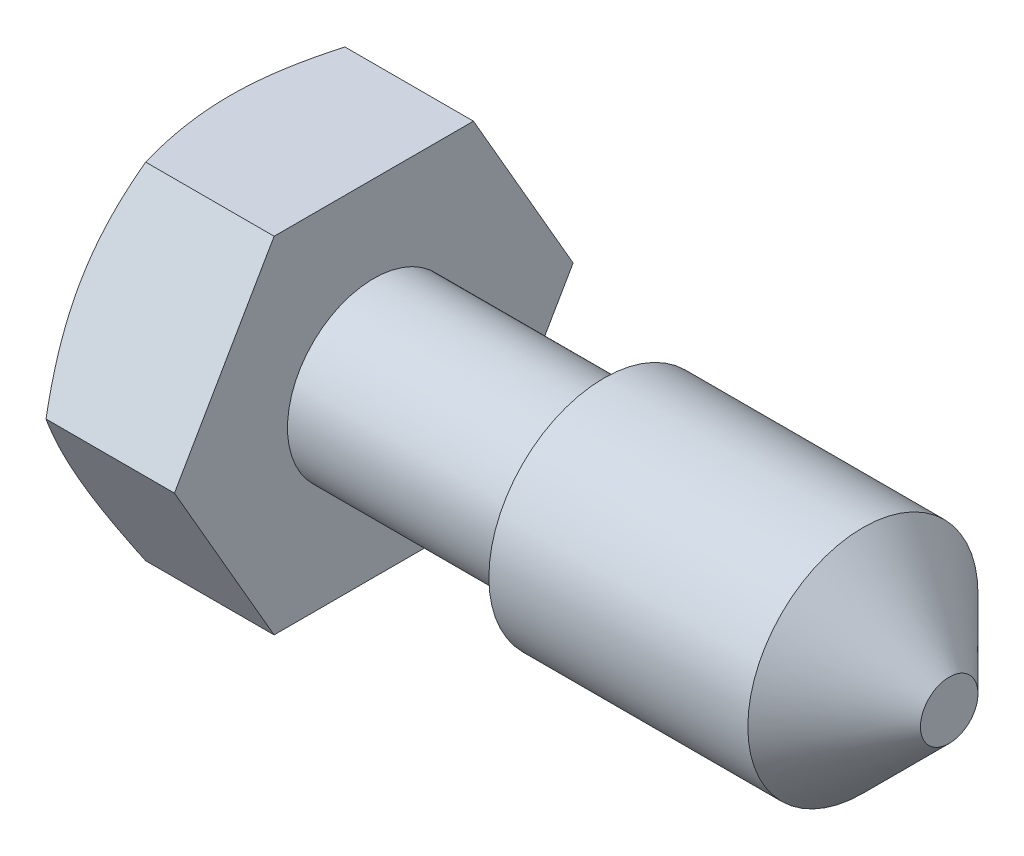
ISO-10303-21;
HEADER;
FILE_DESCRIPTION(('STEP AP214'),'2;1');
FILE_NAME('part.step','',(''),(''),'','','');
FILE_SCHEMA(('AUTOMOTIVE_DESIGN { 1 0 10303 214 1 1 1 1 }'));
ENDSEC;
DATA;
#1=APPLICATION_CONTEXT('core data for automotive mechanical design processes');
#2=APPLICATION_PROTOCOL_DEFINITION('international standard','automotive_design',2000,#1);
#3=PRODUCT_CONTEXT('',#1,'mechanical');
#4=PRODUCT('Part','Part','',(#3));
#5=PRODUCT_RELATED_PRODUCT_CATEGORY('part','',(#4));
#6=PRODUCT_DEFINITION_FORMATION('','',#4);
#7=PRODUCT_DEFINITION_CONTEXT('part definition',#1,'design');
#8=PRODUCT_DEFINITION('design','',#6,#7);
#9=PRODUCT_DEFINITION_SHAPE('','',#8);
#10=(LENGTH_UNIT() NAMED_UNIT(*) SI_UNIT(.MILLI.,.METRE.));
#11=(NAMED_UNIT(*) PLANE_ANGLE_UNIT() SI_UNIT($,.RADIAN.));
#12=(NAMED_UNIT(*) SI_UNIT($,.STERADIAN.) SOLID_ANGLE_UNIT());
#13=UNCERTAINTY_MEASURE_WITH_UNIT(LENGTH_MEASURE(1.E-05),#10,'distance_accuracy_value','');
#14=(GEOMETRIC_REPRESENTATION_CONTEXT(3) GLOBAL_UNCERTAINTY_ASSIGNED_CONTEXT((#13)) GLOBAL_UNIT_ASSIGNED_CONTEXT((#10,
#11,#12)) REPRESENTATION_CONTEXT('',''));
#15=CARTESIAN_POINT('',(0.,0.,0.));
#16=DIRECTION('',(0.,0.,1.));
#17=DIRECTION('',(1.,0.,0.));
#18=AXIS2_PLACEMENT_3D('',#15,#16,#17);
#19=CARTESIAN_POINT('',(-3.6999540897682,10.7708461331692,-12.5040193377703));
#20=DIRECTION('',(0.,-1.,0.));
#21=DIRECTION('',(0.,0.,-1.));
#22=AXIS2_PLACEMENT_3D('',#19,#20,#21);
#23=PLANE('',#22);
#24=CARTESIAN_POINT('',(-7.79862520358654,10.7708461331692,-24.2785079720801));
#25=CARTESIAN_POINT('',(-7.92616860120049,10.7708461331692,-24.0160290351992));
#26=CARTESIAN_POINT('',(-8.05308288373378,10.7708461331692,-23.7532445436197));
#27=CARTESIAN_POINT('',(-8.30551089529924,10.7708461331692,-23.2270007093558));
#28=CARTESIAN_POINT('',(-8.43102461052053,10.7708461331692,-22.9635413600481));
#29=CARTESIAN_POINT('',(-8.80528392837625,10.7708461331692,-22.1719864756887));
#30=CARTESIAN_POINT('',(-9.05171053885915,10.7708461331692,-21.6427903793231));
#31=CARTESIAN_POINT('',(-9.53821325997345,10.7708461331692,-20.578052072102));
#32=CARTESIAN_POINT('',(-9.77824830686955,10.7708461331692,-20.0424910537786));
#33=CARTESIAN_POINT('',(-10.2486199906724,10.7708461331692,-18.9671413773528));
#34=CARTESIAN_POINT('',(-10.4789570800287,10.7708461331692,-18.4273529178745));
#35=CARTESIAN_POINT('',(-10.9346553259399,10.7708461331692,-17.3250649512966));
#36=CARTESIAN_POINT('',(-11.1596118049447,10.7708461331692,-16.7623972797285));
#37=CARTESIAN_POINT('',(-11.5927233994467,10.7708461331692,-15.6305099649649));
#38=CARTESIAN_POINT('',(-11.8008766430938,10.7708461331692,-15.0612895998593));
#39=CARTESIAN_POINT('',(-12.1949830715048,10.7708461331692,-13.916444639012));
#40=CARTESIAN_POINT('',(-12.3809803659526,10.7708461331692,-13.3408353493094));
#41=CARTESIAN_POINT('',(-12.7248795649057,10.7708461331692,-12.1813070209649));
#42=CARTESIAN_POINT('',(-12.8827902173579,10.7708461331692,-11.5973906310871));
#43=CARTESIAN_POINT('',(-13.0925010571857,10.7708461331692,-10.7167559431438));
#44=CARTESIAN_POINT('',(-13.1577385617961,10.7708461331692,-10.4232187672798));
#45=CARTESIAN_POINT('',(-13.2783880358251,10.7708461331692,-9.83412159382931));
#46=CARTESIAN_POINT('',(-13.3338002026922,10.7708461331692,-9.53856163701627));
#47=CARTESIAN_POINT('',(-13.4338264849745,10.7708461331692,-8.94561692193409));
#48=CARTESIAN_POINT('',(-13.4784408143115,10.7708461331692,-8.64823219993605));
#49=CARTESIAN_POINT('',(-13.5559852282152,10.7708461331692,-8.05194449500687));
#50=CARTESIAN_POINT('',(-13.5889157735745,10.7708461331692,-7.75304157242322));
#51=CARTESIAN_POINT('',(-13.6420200808553,10.7708461331692,-7.15808075291311));
#52=CARTESIAN_POINT('',(-13.6623567364114,10.7708461331692,-6.86203748531017));
#53=CARTESIAN_POINT('',(-13.6904876308972,10.7708461331692,-6.26935655333435));
#54=CARTESIAN_POINT('',(-13.6982820808168,10.7708461331692,-5.97271889904453));
#55=CARTESIAN_POINT('',(-13.7011427479652,10.7708461331692,-5.37937709768416));
#56=CARTESIAN_POINT('',(-13.6962088447653,10.7708461331692,-5.08267295001105));
#57=CARTESIAN_POINT('',(-13.6737343471042,10.7708461331692,-4.48973920479841));
#58=CARTESIAN_POINT('',(-13.656193152374,10.7708461331692,-4.19350963052777));
#59=CARTESIAN_POINT('',(-13.599495740519,10.7708461331692,-3.48450716239107));
#60=CARTESIAN_POINT('',(-13.5545207782692,10.7708461331692,-3.07218950972229));
#61=CARTESIAN_POINT('',(-13.4425777383644,10.7708461331692,-2.25057202366847));
#62=CARTESIAN_POINT('',(-13.3756067575884,10.7708461331692,-1.84127259593549));
#63=CARTESIAN_POINT('',(-13.1452476149779,10.7708461331692,-0.618404788492472));
#64=CARTESIAN_POINT('',(-12.9524525416108,10.7708461331692,0.189699669272059));
#65=CARTESIAN_POINT('',(-12.6175172191385,10.7708461331692,1.39842321332606));
#66=CARTESIAN_POINT('',(-12.4966275966155,10.7708461331692,1.8052913367039));
#67=CARTESIAN_POINT('',(-12.2421492722448,10.7708461331692,2.61507574427068));
#68=CARTESIAN_POINT('',(-12.1085604780517,10.7708461331692,3.01799199969903));
#69=CARTESIAN_POINT('',(-11.8308395372812,10.7708461331692,3.82000047140178));
#70=CARTESIAN_POINT('',(-11.6867106742926,10.7708461331692,4.21909383518556));
#71=CARTESIAN_POINT('',(-11.3896200984054,10.7708461331692,5.01396036559093));
#72=CARTESIAN_POINT('',(-11.2366585514058,10.7708461331692,5.40973359441283));
#73=CARTESIAN_POINT('',(-10.830472163266,10.7708461331692,6.43218761258803));
#74=CARTESIAN_POINT('',(-10.5715826826644,10.7708461331692,7.05661533493362));
#75=CARTESIAN_POINT('',(-10.0396572120568,10.7708461331692,8.29943687712516));
#76=CARTESIAN_POINT('',(-9.76661993123361,10.7708461331692,8.91783014026071));
#77=CARTESIAN_POINT('',(-9.20959061586262,10.7708461331692,10.1498876568979));
#78=CARTESIAN_POINT('',(-8.92559507910244,10.7708461331692,10.7635503220704));
#79=CARTESIAN_POINT('',(-8.34914364870746,10.7708461331692,11.9868520584745));
#80=CARTESIAN_POINT('',(-8.05668803421583,10.7708461331692,12.5964912616482));
#81=CARTESIAN_POINT('',(-7.46466110760158,10.7708461331692,13.8133640821045));
#82=CARTESIAN_POINT('',(-7.16508032250713,10.7708461331692,14.4205930815326));
#83=CARTESIAN_POINT('',(-6.5605343922391,10.7708461331692,15.6323656508118));
#84=CARTESIAN_POINT('',(-6.25556921098749,10.7708461331692,16.236909202635));
#85=CARTESIAN_POINT('',(-5.6413271392423,10.7708461331692,17.4436604798141));
#86=CARTESIAN_POINT('',(-5.33205104553331,10.7708461331692,18.0458686111991));
#87=CARTESIAN_POINT('',(-4.70990984010232,10.7708461331692,19.2484240893817));
#88=CARTESIAN_POINT('',(-4.39704473803169,10.7708461331692,19.8487714411776));
#89=CARTESIAN_POINT('',(-3.51592364439311,10.7708461331692,21.5293742702445));
#90=CARTESIAN_POINT('',(-2.94433045497042,10.7708461331692,22.6078798293189));
#91=CARTESIAN_POINT('',(-1.79408206881537,10.7708461331692,24.7611810896639));
#92=CARTESIAN_POINT('',(-1.21542650977689,10.7708461331692,25.8359765969462));
#93=CARTESIAN_POINT('',(-0.0545642757393282,10.7708461331692,27.9794465906795));
#94=CARTESIAN_POINT('',(0.527626378966382,10.7708461331692,29.0481297590757));
#95=CARTESIAN_POINT('',(1.40394618170066,10.7708461331692,30.6494446427062));
#96=CARTESIAN_POINT('',(1.69654838523079,10.7708461331692,31.1829131217748));
#97=CARTESIAN_POINT('',(2.28265973081763,10.7708461331692,32.2493507606034));
#98=CARTESIAN_POINT('',(2.57616887168669,10.7708461331692,32.7823199210161));
#99=CARTESIAN_POINT('',(2.87007644480844,10.7708461331692,33.3150693311648));
#100=B_SPLINE_CURVE_WITH_KNOTS('',3,(#24,#25,#26,#27,#28,#29,#30,#31,#32,#33,#34,#35,#36,#37,
#38,#39,#40,#41,#42,#43,#44,#45,#46,#47,#48,#49,#50,#51,#52,#53,#54,#55,#56,#57,#58,#59,#60,#61,
#62,#63,#64,#65,#66,#67,#68,#69,#70,#71,#72,#73,#74,#75,#76,#77,#78,#79,#80,#81,#82,#83,#84,#85,
#86,#87,#88,#89,#90,#91,#92,#93,#94,#95,#96,#97,#98,#99),.UNSPECIFIED.,.F.,.F.,(4,2,2,2,2,2,2,2,
2,2,2,2,2,2,2,2,2,2,2,2,2,2,2,2,2,2,2,2,2,2,2,2,2,2,2,2,2,4),(0.,0.875476937735774,
1.75096250086668,3.50218815524043,5.26278972808009,7.02330907040262,8.84101582430342,
10.6589247888162,12.4731517962467,14.286812745989,15.1887724983129,16.0907141229465,
16.9926378772739,17.894526056997,18.7844909581056,19.6744408877206,20.5643992375781,
21.4543999637003,22.6979894897215,23.9417432155749,26.4305504632448,27.7037852974542,
28.9770293910429,30.2498785019908,31.5227037135423,33.5503569192111,35.5781954508164,
37.6066875279943,39.6351127505492,41.6664049116571,43.6977106885628,45.7286458713806,
47.7595755939941,51.4213702656134,55.0833535869815,58.7342681825016,60.559600938406,
62.3849313049939),.UNSPECIFIED.);
#101=CARTESIAN_POINT('',(-12.6281573200437,10.7708461331692,1.35238712278069));
#102=VERTEX_POINT('',#101);
#103=CARTESIAN_POINT('',(-13.6999540897682,10.7708461331692,-5.57581610749481));
#104=VERTEX_POINT('',#103);
#105=EDGE_CURVE('E33',#102,#104,#100,.F.);
#106=ORIENTED_EDGE('',*,*,#105,.F.);
#107=DIRECTION('',(-1.,0.,0.));
#108=VECTOR('',#107,1.);
#109=CARTESIAN_POINT('',(-3.6999540897682,10.7708461331692,1.35238712278069));
#110=LINE('',#109,#108);
#111=CARTESIAN_POINT('',(-3.6999540897682,10.7708461331692,1.35238712278069));
#112=VERTEX_POINT('',#111);
#113=EDGE_CURVE('E127',#112,#102,#110,.T.);
#114=ORIENTED_EDGE('',*,*,#113,.F.);
#115=DIRECTION('',(0.,0.,1.));
#116=VECTOR('',#115,1.);
#117=CARTESIAN_POINT('',(-3.6999540897682,10.7708461331692,-12.5040193377703));
#118=LINE('',#117,#116);
#119=CARTESIAN_POINT('',(-3.6999540897682,10.7708461331692,-12.5040193377703));
#120=VERTEX_POINT('',#119);
#121=EDGE_CURVE('E262',#120,#112,#118,.T.);
#122=ORIENTED_EDGE('',*,*,#121,.F.);
#123=DIRECTION('',(-1.,0.,0.));
#124=VECTOR('',#123,1.);
#125=CARTESIAN_POINT('',(-3.6999540897682,10.7708461331692,-12.5040193377703));
#126=LINE('',#125,#124);
#127=CARTESIAN_POINT('',(-12.6281573200437,10.7708461331692,-12.5040193377703));
#128=VERTEX_POINT('',#127);
#129=EDGE_CURVE('E116',#120,#128,#126,.T.);
#130=ORIENTED_EDGE('',*,*,#129,.T.);
#131=EDGE_CURVE('E109',#104,#128,#100,.F.);
#132=ORIENTED_EDGE('',*,*,#131,.F.);
#133=EDGE_LOOP('',(#106,#114,#122,#130,#132));
#134=FACE_BOUND('',#133,.T.);
#135=ADVANCED_FACE('F16',(#134),#23,.F.);
#136=CARTESIAN_POINT('',(-3.6999540897682,10.7708461331692,1.35238712278069));
#137=DIRECTION('',(0.,-0.5,-0.866025403784438));
#138=DIRECTION('',(0.,0.866025403784439,-0.5));
#139=AXIS2_PLACEMENT_3D('',#136,#137,#138);
#140=PLANE('',#139);
#141=CARTESIAN_POINT('',(-12.6280906525437,-1.22935386683076,8.28070582311004));
#142=CARTESIAN_POINT('',(-12.7160044575824,-0.965568071588494,8.12840902321852));
#143=CARTESIAN_POINT('',(-12.7999280922115,-0.700798747448957,7.9755443826534));
#144=CARTESIAN_POINT('',(-12.9586878708954,-0.169136850301095,7.66858924321722));
#145=CARTESIAN_POINT('',(-13.0335210260946,0.0977563904623134,7.51449835881757));
#146=CARTESIAN_POINT('',(-13.2429365499141,0.902736539148251,7.04974285328144));
#147=CARTESIAN_POINT('',(-13.3620508530454,1.44400120699434,6.73724355159767));
#148=CARTESIAN_POINT('',(-13.5017230287651,2.25397896232424,6.26960267652034));
#149=CARTESIAN_POINT('',(-13.5415102927278,2.52027223365061,6.11585818463667));
#150=CARTESIAN_POINT('',(-13.6082307205511,3.05409173186608,5.8076573536433));
#151=CARTESIAN_POINT('',(-13.6351636370004,3.32161798238662,5.65320100088998));
#152=CARTESIAN_POINT('',(-13.6754854978513,3.85711649949459,5.34403078788705));
#153=CARTESIAN_POINT('',(-13.6888905368859,4.12508785523796,5.1893174535135));
#154=CARTESIAN_POINT('',(-13.701870996011,4.66127886544327,4.8797474294344));
#155=CARTESIAN_POINT('',(-13.7014468434055,4.92949851197727,4.72489074430605));
#156=CARTESIAN_POINT('',(-13.6877340704254,5.43093551195334,4.43538595738823));
#157=CARTESIAN_POINT('',(-13.6761181071897,5.66418862634699,4.30071720900374));
#158=CARTESIAN_POINT('',(-13.6426460808958,6.1301583749,4.03168944924244));
#159=CARTESIAN_POINT('',(-13.620789293502,6.36287496994101,3.89733046045062));
#160=CARTESIAN_POINT('',(-13.5672166732253,6.82764520921218,3.62899523769608));
#161=CARTESIAN_POINT('',(-13.5354926972753,7.05969814553124,3.49501941244603));
#162=CARTESIAN_POINT('',(-13.4627423140978,7.52271610047422,3.22769587152007));
#163=CARTESIAN_POINT('',(-13.421715274585,7.75368104406278,3.09434819916585));
#164=CARTESIAN_POINT('',(-13.2836424364864,8.45478809193291,2.68956385634729));
#165=CARTESIAN_POINT('',(-13.1728292014289,8.92289987944777,2.41929938981474));
#166=CARTESIAN_POINT('',(-12.9213283228303,9.85214324076066,1.88280048501807));
#167=CARTESIAN_POINT('',(-12.7806997471088,10.3132867124614,1.61655917749661));
#168=CARTESIAN_POINT('',(-12.6280906525437,10.7710461331692,1.35227165272685));
#169=B_SPLINE_CURVE_WITH_KNOTS('',3,(#141,#142,#143,#144,#145,#146,#147,#148,#149,#150,#151,
#152,#153,#154,#155,#156,#157,#158,#159,#160,#161,#162,#163,#164,#165,#166,#167,#168),
.UNSPECIFIED.,.F.,.F.,(4,2,2,2,2,2,2,2,2,2,2,2,2,4),(0.,0.951004872251243,1.90232158356437,
3.80900466161368,4.73894551413569,5.66890426477608,6.59775529889864,7.52657763276929,
8.33514643820577,9.14377244252748,9.95306755799764,10.7624176939264,12.4167102786892,
14.0677556316691),.UNSPECIFIED.);
#170=CARTESIAN_POINT('',(-12.6281573200437,-1.22915386683076,8.2805903530562));
#171=VERTEX_POINT('',#170);
#172=CARTESIAN_POINT('',(-13.6999540897682,4.77084613316925,4.81648873791846));
#173=VERTEX_POINT('',#172);
#174=EDGE_CURVE('E39',#171,#173,#169,.T.);
#175=ORIENTED_EDGE('',*,*,#174,.F.);
#176=DIRECTION('',(-1.,0.,0.));
#177=VECTOR('',#176,1.);
#178=CARTESIAN_POINT('',(-3.6999540897682,-1.22915386683076,8.2805903530562));
#179=LINE('',#178,#177);
#180=CARTESIAN_POINT('',(-3.6999540897682,-1.22915386683076,8.2805903530562));
#181=VERTEX_POINT('',#180);
#182=EDGE_CURVE('E130',#181,#171,#179,.T.);
#183=ORIENTED_EDGE('',*,*,#182,.F.);
#184=DIRECTION('',(0.,-0.866025403784438,0.5));
#185=VECTOR('',#184,1.);
#186=CARTESIAN_POINT('',(-3.6999540897682,10.7708461331692,1.35238712278069));
#187=LINE('',#186,#185);
#188=EDGE_CURVE('E261',#112,#181,#187,.T.);
#189=ORIENTED_EDGE('',*,*,#188,.F.);
#190=ORIENTED_EDGE('',*,*,#113,.T.);
#191=EDGE_CURVE('E176',#173,#102,#169,.T.);
#192=ORIENTED_EDGE('',*,*,#191,.F.);
#193=EDGE_LOOP('',(#175,#183,#189,#190,#192));
#194=FACE_BOUND('',#193,.T.);
#195=ADVANCED_FACE('F248',(#194),#140,.F.);
#196=CARTESIAN_POINT('',(-3.6999540897682,-1.22915386683076,8.2805903530562));
#197=DIRECTION('',(0.,0.5,-0.866025403784439));
#198=DIRECTION('',(0.,0.866025403784439,0.5));
#199=AXIS2_PLACEMENT_3D('',#196,#197,#198);
#200=PLANE('',#199);
#201=CARTESIAN_POINT('',(-12.6280906525437,-13.2293538668308,1.35227165272686));
#202=CARTESIAN_POINT('',(-12.7160044575823,-12.9655680715885,1.50456845261838));
#203=CARTESIAN_POINT('',(-12.7999280922115,-12.700798747449,1.6574330931835));
#204=CARTESIAN_POINT('',(-12.9586878708954,-12.1691368503011,1.96438823261968));
#205=CARTESIAN_POINT('',(-13.0335210260946,-11.9022436095377,2.11847911701933));
#206=CARTESIAN_POINT('',(-13.2429365499141,-11.0972634608517,2.58323462255546));
#207=CARTESIAN_POINT('',(-13.3620508530454,-10.5559987930057,2.89573392423923));
#208=CARTESIAN_POINT('',(-13.5017230287651,-9.74602103767576,3.36337479931655));
#209=CARTESIAN_POINT('',(-13.5415102927278,-9.47972776634938,3.51711929120022));
#210=CARTESIAN_POINT('',(-13.6082307205511,-8.94590826813392,3.82532012219359));
#211=CARTESIAN_POINT('',(-13.6351636370004,-8.67838201761338,3.97977647494692));
#212=CARTESIAN_POINT('',(-13.6754854978513,-8.14288350050541,4.28894668794985));
#213=CARTESIAN_POINT('',(-13.6888905368859,-7.87491214476203,4.4436600223234));
#214=CARTESIAN_POINT('',(-13.701870996011,-7.33872113455672,4.75323004640249));
#215=CARTESIAN_POINT('',(-13.7014468434055,-7.07050148802272,4.90808673153084));
#216=CARTESIAN_POINT('',(-13.6877340704254,-6.56906448804666,5.19759151844866));
#217=CARTESIAN_POINT('',(-13.6761181071897,-6.335811373653,5.33226026683316));
#218=CARTESIAN_POINT('',(-13.6426460808958,-5.86984162509999,5.60128802659446));
#219=CARTESIAN_POINT('',(-13.620789293502,-5.63712503005899,5.73564701538628));
#220=CARTESIAN_POINT('',(-13.5672166732253,-5.17235479078781,6.00398223814081));
#221=CARTESIAN_POINT('',(-13.5354926972753,-4.94030185446875,6.13795806339087));
#222=CARTESIAN_POINT('',(-13.4627423140978,-4.47728389952578,6.40528160431682));
#223=CARTESIAN_POINT('',(-13.421715274585,-4.24631895593722,6.53862927667105));
#224=CARTESIAN_POINT('',(-13.2836424364864,-3.54521190806709,6.94341361948961));
#225=CARTESIAN_POINT('',(-13.1728292014289,-3.07710012055223,7.21367808602215));
#226=CARTESIAN_POINT('',(-12.9213283228303,-2.14785675923933,7.75017699081882));
#227=CARTESIAN_POINT('',(-12.7806997471088,-1.6867132875386,8.01641829834028));
#228=CARTESIAN_POINT('',(-12.6280906525437,-1.22895386683075,8.28070582311004));
#229=B_SPLINE_CURVE_WITH_KNOTS('',3,(#201,#202,#203,#204,#205,#206,#207,#208,#209,#210,#211,
#212,#213,#214,#215,#216,#217,#218,#219,#220,#221,#222,#223,#224,#225,#226,#227,#228),
.UNSPECIFIED.,.F.,.F.,(4,2,2,2,2,2,2,2,2,2,2,2,2,4),(0.,0.951004872251244,1.90232158356437,
3.80900466161368,4.73894551413569,5.66890426477608,6.59775529889864,7.52657763276929,
8.33514643820578,9.14377244252748,9.95306755799765,10.7624176939264,12.4167102786892,
14.0677556316691),.UNSPECIFIED.);
#230=CARTESIAN_POINT('',(-12.6281573200437,-13.2291538668308,1.3523871227807));
#231=VERTEX_POINT('',#230);
#232=CARTESIAN_POINT('',(-13.6999540897682,-7.22915386683076,4.81648873791846));
#233=VERTEX_POINT('',#232);
#234=EDGE_CURVE('E161',#231,#233,#229,.T.);
#235=ORIENTED_EDGE('',*,*,#234,.F.);
#236=DIRECTION('',(-1.,0.,0.));
#237=VECTOR('',#236,1.);
#238=CARTESIAN_POINT('',(-3.6999540897682,-13.2291538668308,1.3523871227807));
#239=LINE('',#238,#237);
#240=CARTESIAN_POINT('',(-3.6999540897682,-13.2291538668308,1.3523871227807));
#241=VERTEX_POINT('',#240);
#242=EDGE_CURVE('E119',#241,#231,#239,.T.);
#243=ORIENTED_EDGE('',*,*,#242,.F.);
#244=DIRECTION('',(0.,-0.866025403784439,-0.5));
#245=VECTOR('',#244,1.);
#246=CARTESIAN_POINT('',(-3.6999540897682,-1.22915386683076,8.2805903530562));
#247=LINE('',#246,#245);
#248=EDGE_CURVE('E263',#181,#241,#247,.T.);
#249=ORIENTED_EDGE('',*,*,#248,.F.);
#250=ORIENTED_EDGE('',*,*,#182,.T.);
#251=EDGE_CURVE('E151',#233,#171,#229,.T.);
#252=ORIENTED_EDGE('',*,*,#251,.F.);
#253=EDGE_LOOP('',(#235,#243,#249,#250,#252));
#254=FACE_BOUND('',#253,.T.);
#255=ADVANCED_FACE('F157',(#254),#200,.F.);
#256=CARTESIAN_POINT('',(-3.6999540897682,-13.2291538668308,1.3523871227807));
#257=DIRECTION('',(0.,1.,0.));
#258=DIRECTION('',(0.,0.,1.));
#259=AXIS2_PLACEMENT_3D('',#256,#257,#258);
#260=PLANE('',#259);
#261=CARTESIAN_POINT('',(-7.79862520358655,-13.2291538668308,-24.2785079720801));
#262=CARTESIAN_POINT('',(-7.92616860120049,-13.2291538668308,-24.0160290351992));
#263=CARTESIAN_POINT('',(-8.05308288373378,-13.2291538668308,-23.7532445436197));
#264=CARTESIAN_POINT('',(-8.30551089529925,-13.2291538668308,-23.2270007093558));
#265=CARTESIAN_POINT('',(-8.43102461052054,-13.2291538668308,-22.963541360048));
#266=CARTESIAN_POINT('',(-8.80528392837626,-13.2291538668308,-22.1719864756887));
#267=CARTESIAN_POINT('',(-9.05171053885916,-13.2291538668308,-21.6427903793231));
#268=CARTESIAN_POINT('',(-9.53821325997346,-13.2291538668308,-20.578052072102));
#269=CARTESIAN_POINT('',(-9.77824830686955,-13.2291538668308,-20.0424910537786));
#270=CARTESIAN_POINT('',(-10.2486199906724,-13.2291538668308,-18.9671413773528));
#271=CARTESIAN_POINT('',(-10.4789570800287,-13.2291538668308,-18.4273529178745));
#272=CARTESIAN_POINT('',(-10.9346553259399,-13.2291538668308,-17.3250649512966));
#273=CARTESIAN_POINT('',(-11.1596118049448,-13.2291538668308,-16.7623972797285));
#274=CARTESIAN_POINT('',(-11.5927233994467,-13.2291538668308,-15.6305099649649));
#275=CARTESIAN_POINT('',(-11.8008766430938,-13.2291538668308,-15.0612895998593));
#276=CARTESIAN_POINT('',(-12.1949830715048,-13.2291538668308,-13.916444639012));
#277=CARTESIAN_POINT('',(-12.3809803659526,-13.2291538668308,-13.3408353493094));
#278=CARTESIAN_POINT('',(-12.7248795649057,-13.2291538668308,-12.1813070209649));
#279=CARTESIAN_POINT('',(-12.8827902173579,-13.2291538668308,-11.597390631087));
#280=CARTESIAN_POINT('',(-13.0925010571857,-13.2291538668308,-10.7167559431438));
#281=CARTESIAN_POINT('',(-13.1577385617961,-13.2291538668308,-10.4232187672798));
#282=CARTESIAN_POINT('',(-13.2783880358251,-13.2291538668308,-9.8341215938293));
#283=CARTESIAN_POINT('',(-13.3338002026922,-13.2291538668308,-9.53856163701627));
#284=CARTESIAN_POINT('',(-13.4338264849745,-13.2291538668308,-8.94561692193409));
#285=CARTESIAN_POINT('',(-13.4784408143115,-13.2291538668308,-8.64823219993604));
#286=CARTESIAN_POINT('',(-13.5559852282152,-13.2291538668308,-8.05194449500687));
#287=CARTESIAN_POINT('',(-13.5889157735745,-13.2291538668308,-7.75304157242321));
#288=CARTESIAN_POINT('',(-13.6420200808553,-13.2291538668308,-7.15808075291311));
#289=CARTESIAN_POINT('',(-13.6623567364114,-13.2291538668308,-6.86203748531017));
#290=CARTESIAN_POINT('',(-13.6904876308972,-13.2291538668308,-6.26935655333435));
#291=CARTESIAN_POINT('',(-13.6982820808168,-13.2291538668308,-5.97271889904453));
#292=CARTESIAN_POINT('',(-13.7011427479652,-13.2291538668308,-5.37937709768416));
#293=CARTESIAN_POINT('',(-13.6962088447653,-13.2291538668308,-5.08267295001105));
#294=CARTESIAN_POINT('',(-13.6737343471043,-13.2291538668308,-4.48973920479841));
#295=CARTESIAN_POINT('',(-13.656193152374,-13.2291538668308,-4.19350963052777));
#296=CARTESIAN_POINT('',(-13.599495740519,-13.2291538668308,-3.48450716239107));
#297=CARTESIAN_POINT('',(-13.5545207782692,-13.2291538668308,-3.07218950972229));
#298=CARTESIAN_POINT('',(-13.4425777383644,-13.2291538668308,-2.25057202366846));
#299=CARTESIAN_POINT('',(-13.3756067575884,-13.2291538668308,-1.84127259593548));
#300=CARTESIAN_POINT('',(-13.1452476149779,-13.2291538668308,-0.618404788492465));
#301=CARTESIAN_POINT('',(-12.9524525416108,-13.2291538668308,0.189699669272065));
#302=CARTESIAN_POINT('',(-12.6175172191385,-13.2291538668308,1.39842321332606));
#303=CARTESIAN_POINT('',(-12.4966275966155,-13.2291538668308,1.80529133670391));
#304=CARTESIAN_POINT('',(-12.2421492722448,-13.2291538668308,2.61507574427068));
#305=CARTESIAN_POINT('',(-12.1085604780517,-13.2291538668308,3.01799199969904));
#306=CARTESIAN_POINT('',(-11.8308395372812,-13.2291538668308,3.82000047140179));
#307=CARTESIAN_POINT('',(-11.6867106742926,-13.2291538668308,4.21909383518557));
#308=CARTESIAN_POINT('',(-11.3896200984054,-13.2291538668308,5.01396036559094));
#309=CARTESIAN_POINT('',(-11.2366585514058,-13.2291538668308,5.40973359441284));
#310=CARTESIAN_POINT('',(-10.830472163266,-13.2291538668308,6.43218761258803));
#311=CARTESIAN_POINT('',(-10.5715826826644,-13.2291538668308,7.05661533493363));
#312=CARTESIAN_POINT('',(-10.0396572120568,-13.2291538668308,8.29943687712516));
#313=CARTESIAN_POINT('',(-9.76661993123361,-13.2291538668308,8.91783014026072));
#314=CARTESIAN_POINT('',(-9.20959061586262,-13.2291538668308,10.1498876568979));
#315=CARTESIAN_POINT('',(-8.92559507910244,-13.2291538668308,10.7635503220704));
#316=CARTESIAN_POINT('',(-8.34914364870746,-13.2291538668308,11.9868520584745));
#317=CARTESIAN_POINT('',(-8.05668803421583,-13.2291538668308,12.5964912616482));
#318=CARTESIAN_POINT('',(-7.46466110760158,-13.2291538668308,13.8133640821045));
#319=CARTESIAN_POINT('',(-7.16508032250713,-13.2291538668308,14.4205930815326));
#320=CARTESIAN_POINT('',(-6.5605343922391,-13.2291538668308,15.6323656508118));
#321=CARTESIAN_POINT('',(-6.25556921098749,-13.2291538668308,16.236909202635));
#322=CARTESIAN_POINT('',(-5.6413271392423,-13.2291538668308,17.4436604798141));
#323=CARTESIAN_POINT('',(-5.33205104553331,-13.2291538668308,18.0458686111991));
#324=CARTESIAN_POINT('',(-4.70990984010232,-13.2291538668308,19.2484240893817));
#325=CARTESIAN_POINT('',(-4.39704473803169,-13.2291538668308,19.8487714411776));
#326=CARTESIAN_POINT('',(-3.51592364439311,-13.2291538668308,21.5293742702445));
#327=CARTESIAN_POINT('',(-2.94433045497042,-13.2291538668308,22.6078798293189));
#328=CARTESIAN_POINT('',(-1.79408206881538,-13.2291538668308,24.7611810896639));
#329=CARTESIAN_POINT('',(-1.2154265097769,-13.2291538668308,25.8359765969462));
#330=CARTESIAN_POINT('',(-0.0545642757393337,-13.2291538668308,27.9794465906795));
#331=CARTESIAN_POINT('',(0.527626378966382,-13.2291538668308,29.0481297590757));
#332=CARTESIAN_POINT('',(1.40394618170066,-13.2291538668308,30.6494446427062));
#333=CARTESIAN_POINT('',(1.69654838523079,-13.2291538668308,31.1829131217748));
#334=CARTESIAN_POINT('',(2.28265973081763,-13.2291538668308,32.2493507606034));
#335=CARTESIAN_POINT('',(2.57616887168668,-13.2291538668308,32.7823199210161));
#336=CARTESIAN_POINT('',(2.87007644480844,-13.2291538668308,33.3150693311648));
#337=B_SPLINE_CURVE_WITH_KNOTS('',3,(#261,#262,#263,#264,#265,#266,#267,#268,#269,#270,#271,
#272,#273,#274,#275,#276,#277,#278,#279,#280,#281,#282,#283,#284,#285,#286,#287,#288,#289,#290,
#291,#292,#293,#294,#295,#296,#297,#298,#299,#300,#301,#302,#303,#304,#305,#306,#307,#308,#309,
#310,#311,#312,#313,#314,#315,#316,#317,#318,#319,#320,#321,#322,#323,#324,#325,#326,#327,#328,
#329,#330,#331,#332,#333,#334,#335,#336),.UNSPECIFIED.,.F.,.F.,(4,2,2,2,2,2,2,2,2,2,2,2,2,2,2,2,
2,2,2,2,2,2,2,2,2,2,2,2,2,2,2,2,2,2,2,2,2,4),(0.,0.87547693773577,1.75096250086667,
3.50218815524042,5.26278972808009,7.02330907040262,8.84101582430342,10.6589247888162,
12.4731517962467,14.286812745989,15.1887724983129,16.0907141229465,16.9926378772739,
17.894526056997,18.7844909581055,19.6744408877206,20.5643992375781,21.4543999637003,
22.6979894897215,23.9417432155749,26.4305504632448,27.7037852974542,28.9770293910429,
30.2498785019908,31.5227037135423,33.5503569192111,35.5781954508164,37.6066875279943,
39.6351127505492,41.666404911657,43.6977106885628,45.7286458713806,47.7595755939941,
51.4213702656133,55.0833535869815,58.7342681825016,60.5596009384059,62.3849313049939),.UNSPECIFIED.);
#338=CARTESIAN_POINT('',(-12.6281573200437,-13.2291538668308,-12.5040193377703));
#339=VERTEX_POINT('',#338);
#340=CARTESIAN_POINT('',(-13.6999540897682,-13.2291538668308,-5.57581610749481));
#341=VERTEX_POINT('',#340);
#342=EDGE_CURVE('E169',#339,#341,#337,.T.);
#343=ORIENTED_EDGE('',*,*,#342,.F.);
#344=DIRECTION('',(-1.,0.,0.));
#345=VECTOR('',#344,1.);
#346=CARTESIAN_POINT('',(-3.6999540897682,-13.2291538668308,-12.5040193377703));
#347=LINE('',#346,#345);
#348=CARTESIAN_POINT('',(-3.6999540897682,-13.2291538668308,-12.5040193377703));
#349=VERTEX_POINT('',#348);
#350=EDGE_CURVE('E113',#349,#339,#347,.T.);
#351=ORIENTED_EDGE('',*,*,#350,.F.);
#352=DIRECTION('',(0.,0.,-1.));
#353=VECTOR('',#352,1.);
#354=CARTESIAN_POINT('',(-3.6999540897682,-13.2291538668308,1.3523871227807));
#355=LINE('',#354,#353);
#356=EDGE_CURVE('E275',#241,#349,#355,.T.);
#357=ORIENTED_EDGE('',*,*,#356,.F.);
#358=ORIENTED_EDGE('',*,*,#242,.T.);
#359=EDGE_CURVE('E163',#341,#231,#337,.T.);
#360=ORIENTED_EDGE('',*,*,#359,.F.);
#361=EDGE_LOOP('',(#343,#351,#357,#358,#360));
#362=FACE_BOUND('',#361,.T.);
#363=ADVANCED_FACE('F217',(#362),#260,.F.);
#364=CARTESIAN_POINT('',(-3.6999540897682,-13.2291538668308,-12.5040193377703));
#365=DIRECTION('',(0.,0.5,0.866025403784439));
#366=DIRECTION('',(0.,-0.866025403784439,0.5));
#367=AXIS2_PLACEMENT_3D('',#364,#365,#366);
#368=PLANE('',#367);
#369=CARTESIAN_POINT('',(-12.6280906525437,-1.22895386683075,-19.4323380380997));
#370=CARTESIAN_POINT('',(-12.7160044575823,-1.49273966207301,-19.2800412382082));
#371=CARTESIAN_POINT('',(-12.7999280922115,-1.75750898621255,-19.127176597643));
#372=CARTESIAN_POINT('',(-12.9586878708954,-2.28917088336041,-18.8202214582068));
#373=CARTESIAN_POINT('',(-13.0335210260946,-2.55606412412382,-18.6661305738072));
#374=CARTESIAN_POINT('',(-13.242936549914,-3.36104427280976,-18.2013750682711));
#375=CARTESIAN_POINT('',(-13.3620508530453,-3.90230894065585,-17.8888757665873));
#376=CARTESIAN_POINT('',(-13.501723028765,-4.71228669598575,-17.42123489151));
#377=CARTESIAN_POINT('',(-13.5415102927278,-4.97857996731212,-17.2674903996263));
#378=CARTESIAN_POINT('',(-13.6082307205511,-5.51239946552759,-16.9592895686329));
#379=CARTESIAN_POINT('',(-13.6351636370004,-5.77992571604813,-16.8048332158796));
#380=CARTESIAN_POINT('',(-13.6754854978513,-6.3154242331561,-16.4956630028767));
#381=CARTESIAN_POINT('',(-13.6888905368859,-6.58339558889948,-16.3409496685031));
#382=CARTESIAN_POINT('',(-13.701870996011,-7.11958659910479,-16.031379644424));
#383=CARTESIAN_POINT('',(-13.7014468434055,-7.38780624563879,-15.8765229592957));
#384=CARTESIAN_POINT('',(-13.6877340704254,-7.88924324561486,-15.5870181723779));
#385=CARTESIAN_POINT('',(-13.6761181071897,-8.1224963600085,-15.4523494239934));
#386=CARTESIAN_POINT('',(-13.6426460808958,-8.58846610856152,-15.1833216642321));
#387=CARTESIAN_POINT('',(-13.620789293502,-8.82118270360252,-15.0489626754403));
#388=CARTESIAN_POINT('',(-13.5672166732253,-9.28595294287369,-14.7806274526857));
#389=CARTESIAN_POINT('',(-13.5354926972753,-9.51800587919275,-14.6466516274357));
#390=CARTESIAN_POINT('',(-13.4627423140978,-9.98102383413573,-14.3793280865097));
#391=CARTESIAN_POINT('',(-13.421715274585,-10.2119887777243,-14.2459804141555));
#392=CARTESIAN_POINT('',(-13.2836424364864,-10.9130958255944,-13.8411960713369));
#393=CARTESIAN_POINT('',(-13.1728292014289,-11.3812076131093,-13.5709316048044));
#394=CARTESIAN_POINT('',(-12.9213283228303,-12.3104509744222,-13.0344327000077));
#395=CARTESIAN_POINT('',(-12.7806997471088,-12.7715944461229,-12.7681913924862));
#396=CARTESIAN_POINT('',(-12.6280906525437,-13.2293538668308,-12.5039038677165));
#397=B_SPLINE_CURVE_WITH_KNOTS('',3,(#369,#370,#371,#372,#373,#374,#375,#376,#377,#378,#379,
#380,#381,#382,#383,#384,#385,#386,#387,#388,#389,#390,#391,#392,#393,#394,#395,#396),
.UNSPECIFIED.,.F.,.F.,(4,2,2,2,2,2,2,2,2,2,2,2,2,4),(0.,0.951004872251246,1.90232158356437,
3.80900466161368,4.7389455141357,5.66890426477609,6.59775529889865,7.5265776327693,
8.33514643820578,9.14377244252749,9.95306755799765,10.7624176939264,12.4167102786892,
14.0677556316691),.UNSPECIFIED.);
#398=CARTESIAN_POINT('',(-12.6281573200437,-1.22915386683075,-19.4322225680458));
#399=VERTEX_POINT('',#398);
#400=CARTESIAN_POINT('',(-13.6999540897682,-7.22915386683076,-15.9681209529081));
#401=VERTEX_POINT('',#400);
#402=EDGE_CURVE('E95',#399,#401,#397,.T.);
#403=ORIENTED_EDGE('',*,*,#402,.F.);
#404=DIRECTION('',(-1.,0.,0.));
#405=VECTOR('',#404,1.);
#406=CARTESIAN_POINT('',(-3.6999540897682,-1.22915386683075,-19.4322225680458));
#407=LINE('',#406,#405);
#408=CARTESIAN_POINT('',(-3.6999540897682,-1.22915386683075,-19.4322225680458));
#409=VERTEX_POINT('',#408);
#410=EDGE_CURVE('E106',#409,#399,#407,.T.);
#411=ORIENTED_EDGE('',*,*,#410,.F.);
#412=DIRECTION('',(0.,0.866025403784439,-0.5));
#413=VECTOR('',#412,1.);
#414=CARTESIAN_POINT('',(-3.6999540897682,-13.2291538668308,-12.5040193377703));
#415=LINE('',#414,#413);
#416=EDGE_CURVE('E273',#349,#409,#415,.T.);
#417=ORIENTED_EDGE('',*,*,#416,.F.);
#418=ORIENTED_EDGE('',*,*,#350,.T.);
#419=EDGE_CURVE('E108',#401,#339,#397,.T.);
#420=ORIENTED_EDGE('',*,*,#419,.F.);
#421=EDGE_LOOP('',(#403,#411,#417,#418,#420));
#422=FACE_BOUND('',#421,.T.);
#423=ADVANCED_FACE('F102',(#422),#368,.F.);
#424=CARTESIAN_POINT('',(-3.6999540897682,-1.22915386683075,-19.4322225680458));
#425=DIRECTION('',(0.,-0.5,0.866025403784439));
#426=DIRECTION('',(0.,-0.866025403784439,-0.5));
#427=AXIS2_PLACEMENT_3D('',#424,#425,#426);
#428=PLANE('',#427);
#429=CARTESIAN_POINT('',(-12.6280906525437,10.7710461331692,-12.5039038677165));
#430=CARTESIAN_POINT('',(-12.7160044575823,10.507260337927,-12.656200667608));
#431=CARTESIAN_POINT('',(-12.7999280922115,10.2424910137874,-12.8090653081731));
#432=CARTESIAN_POINT('',(-12.9586878708954,9.71082911663958,-13.1160204476093));
#433=CARTESIAN_POINT('',(-13.0335210260946,9.44393587587617,-13.270111332009));
#434=CARTESIAN_POINT('',(-13.242936549914,8.63895572719023,-13.7348668375451));
#435=CARTESIAN_POINT('',(-13.3620508530453,8.09769105934414,-14.0473661392289));
#436=CARTESIAN_POINT('',(-13.501723028765,7.28771330401425,-14.5150070143062));
#437=CARTESIAN_POINT('',(-13.5415102927277,7.02142003268787,-14.6687515061899));
#438=CARTESIAN_POINT('',(-13.6082307205511,6.4876005344724,-14.9769523371832));
#439=CARTESIAN_POINT('',(-13.6351636370004,6.22007428395186,-15.1314086899366));
#440=CARTESIAN_POINT('',(-13.6754854978513,5.68457576684389,-15.4405789029395));
#441=CARTESIAN_POINT('',(-13.6888905368859,5.41660441110051,-15.595292237313));
#442=CARTESIAN_POINT('',(-13.701870996011,4.8804134008952,-15.9048622613921));
#443=CARTESIAN_POINT('',(-13.7014468434055,4.6121937543612,-16.0597189465205));
#444=CARTESIAN_POINT('',(-13.6877340704254,4.11075675438514,-16.3492237334383));
#445=CARTESIAN_POINT('',(-13.6761181071897,3.87750363999149,-16.4838924818228));
#446=CARTESIAN_POINT('',(-13.6426460808958,3.41153389143848,-16.7529202415841));
#447=CARTESIAN_POINT('',(-13.620789293502,3.17881729639747,-16.8872792303759));
#448=CARTESIAN_POINT('',(-13.5672166732253,2.7140470571263,-17.1556144531305));
#449=CARTESIAN_POINT('',(-13.5354926972753,2.48199412080724,-17.2895902783805));
#450=CARTESIAN_POINT('',(-13.4627423140977,2.01897616586426,-17.5569138193065));
#451=CARTESIAN_POINT('',(-13.421715274585,1.7880112222757,-17.6902614916607));
#452=CARTESIAN_POINT('',(-13.2836424364864,1.08690417440558,-18.0950458344792));
#453=CARTESIAN_POINT('',(-13.1728292014289,0.618792386890716,-18.3653103010118));
#454=CARTESIAN_POINT('',(-12.9213283228303,-0.310450974422176,-18.9018092058085));
#455=CARTESIAN_POINT('',(-12.7806997471088,-0.771594446122907,-19.1680505133299));
#456=CARTESIAN_POINT('',(-12.6280906525437,-1.22935386683075,-19.4323380380997));
#457=B_SPLINE_CURVE_WITH_KNOTS('',3,(#429,#430,#431,#432,#433,#434,#435,#436,#437,#438,#439,
#440,#441,#442,#443,#444,#445,#446,#447,#448,#449,#450,#451,#452,#453,#454,#455,#456),
.UNSPECIFIED.,.F.,.F.,(4,2,2,2,2,2,2,2,2,2,2,2,2,4),(0.,0.951004872251247,1.90232158356437,
3.80900466161368,4.7389455141357,5.66890426477609,6.59775529889865,7.5265776327693,
8.33514643820578,9.14377244252749,9.95306755799765,10.7624176939264,12.4167102786892,
14.0677556316691),.UNSPECIFIED.);
#458=CARTESIAN_POINT('',(-13.6999540897682,4.77084613316925,-15.9681209529081));
#459=VERTEX_POINT('',#458);
#460=EDGE_CURVE('E98',#128,#459,#457,.T.);
#461=ORIENTED_EDGE('',*,*,#460,.F.);
#462=ORIENTED_EDGE('',*,*,#129,.F.);
#463=DIRECTION('',(0.,0.866025403784439,0.5));
#464=VECTOR('',#463,1.);
#465=CARTESIAN_POINT('',(-3.6999540897682,-1.22915386683075,-19.4322225680458));
#466=LINE('',#465,#464);
#467=EDGE_CURVE('E111',#409,#120,#466,.T.);
#468=ORIENTED_EDGE('',*,*,#467,.F.);
#469=ORIENTED_EDGE('',*,*,#410,.T.);
#470=EDGE_CURVE('E90',#459,#399,#457,.T.);
#471=ORIENTED_EDGE('',*,*,#470,.F.);
#472=EDGE_LOOP('',(#461,#462,#468,#469,#471));
#473=FACE_BOUND('',#472,.T.);
#474=ADVANCED_FACE('F115',(#473),#428,.F.);
#475=CARTESIAN_POINT('',(36.3000459100354,-1.22915386683076,-5.57581610749481));
#476=DIRECTION('',(-1.,0.,0.));
#477=DIRECTION('',(0.,0.,1.));
#478=AXIS2_PLACEMENT_3D('',#475,#476,#477);
#479=CYLINDRICAL_SURFACE('',#478,6.);
#480=CARTESIAN_POINT('',(-3.69995408996465,-1.22915386683076,-5.57581610749481));
#481=DIRECTION('',(1.,0.,0.));
#482=DIRECTION('',(0.,0.,-1.));
#483=AXIS2_PLACEMENT_3D('',#480,#481,#482);
#484=CIRCLE('',#483,6.);
#485=CARTESIAN_POINT('',(-3.69995408996465,-1.22915386683076,-11.5758161074948));
#486=VERTEX_POINT('',#485);
#487=EDGE_CURVE('E270',#486,#486,#484,.T.);
#488=ORIENTED_EDGE('',*,*,#487,.T.);
#489=EDGE_LOOP('',(#488));
#490=FACE_BOUND('',#489,.T.);
#491=CARTESIAN_POINT('',(12.3000459098466,-1.22915386683076,-5.57581610749481));
#492=DIRECTION('',(1.,0.,0.));
#493=DIRECTION('',(0.,0.,-1.));
#494=AXIS2_PLACEMENT_3D('',#491,#492,#493);
#495=CIRCLE('',#494,6.);
#496=CARTESIAN_POINT('',(12.3000459098466,-1.22915386683076,-11.5758161074948));
#497=VERTEX_POINT('',#496);
#498=EDGE_CURVE('E135',#497,#497,#495,.T.);
#499=ORIENTED_EDGE('',*,*,#498,.F.);
#500=EDGE_LOOP('',(#499));
#501=FACE_BOUND('',#500,.T.);
#502=ADVANCED_FACE('F227',(#490,#501),#479,.T.);
#503=CARTESIAN_POINT('',(-3.6999540897682,10.7708461331692,15.2087935833317));
#504=DIRECTION('',(1.,0.,0.));
#505=DIRECTION('',(0.,0.,-1.));
#506=AXIS2_PLACEMENT_3D('',#503,#504,#505);
#507=PLANE('',#506);
#508=ORIENTED_EDGE('',*,*,#121,.T.);
#509=ORIENTED_EDGE('',*,*,#188,.T.);
#510=ORIENTED_EDGE('',*,*,#248,.T.);
#511=ORIENTED_EDGE('',*,*,#356,.T.);
#512=ORIENTED_EDGE('',*,*,#416,.T.);
#513=ORIENTED_EDGE('',*,*,#467,.T.);
#514=EDGE_LOOP('',(#508,#509,#510,#511,#512,#513));
#515=FACE_BOUND('',#514,.T.);
#516=ORIENTED_EDGE('',*,*,#487,.F.);
#517=EDGE_LOOP('',(#516));
#518=FACE_BOUND('',#517,.T.);
#519=ADVANCED_FACE('F234',(#515,#518),#507,.T.);
#520=CARTESIAN_POINT('',(12.3000459098466,-1.22915386683076,-5.57581610749481));
#521=DIRECTION('',(1.,0.,0.));
#522=DIRECTION('',(0.,0.,-1.));
#523=AXIS2_PLACEMENT_3D('',#520,#521,#522);
#524=PLANE('',#523);
#525=CARTESIAN_POINT('',(12.3000459098466,-1.22915386683076,-5.57581610749481));
#526=DIRECTION('',(1.,0.,0.));
#527=DIRECTION('',(0.,0.,-1.));
#528=AXIS2_PLACEMENT_3D('',#525,#526,#527);
#529=CIRCLE('',#528,8.);
#530=CARTESIAN_POINT('',(12.3000459098466,-1.22915386683076,-13.5758161074948));
#531=VERTEX_POINT('',#530);
#532=EDGE_CURVE('E167',#531,#531,#529,.T.);
#533=ORIENTED_EDGE('',*,*,#532,.F.);
#534=EDGE_LOOP('',(#533));
#535=FACE_BOUND('',#534,.T.);
#536=ORIENTED_EDGE('',*,*,#498,.T.);
#537=EDGE_LOOP('',(#536));
#538=FACE_BOUND('',#537,.T.);
#539=ADVANCED_FACE('F192',(#535,#538),#524,.F.);
#540=CARTESIAN_POINT('',(12.3000459098466,-1.22915386683076,-5.57581610749481));
#541=DIRECTION('',(1.,0.,0.));
#542=DIRECTION('',(0.,0.,-1.));
#543=AXIS2_PLACEMENT_3D('',#540,#541,#542);
#544=CYLINDRICAL_SURFACE('',#543,8.);
#545=CARTESIAN_POINT('',(30.3000459098466,-1.22915386683076,-5.57581610749481));
#546=DIRECTION('',(1.,0.,0.));
#547=DIRECTION('',(0.,0.,-1.));
#548=AXIS2_PLACEMENT_3D('',#545,#546,#547);
#549=CIRCLE('',#548,8.);
#550=CARTESIAN_POINT('',(30.3000459098466,-1.22915386683076,2.4241838925052));
#551=VERTEX_POINT('',#550);
#552=EDGE_CURVE('E140',#551,#551,#549,.F.);
#553=ORIENTED_EDGE('',*,*,#552,.T.);
#554=EDGE_LOOP('',(#553));
#555=FACE_BOUND('',#554,.T.);
#556=ORIENTED_EDGE('',*,*,#532,.T.);
#557=EDGE_LOOP('',(#556));
#558=FACE_BOUND('',#557,.T.);
#559=ADVANCED_FACE('F239',(#555,#558),#544,.T.);
#560=CARTESIAN_POINT('',(36.3000459100354,-1.22915386683076,-5.57581610749481));
#561=DIRECTION('',(1.,0.,0.));
#562=DIRECTION('',(0.,0.,-1.));
#563=AXIS2_PLACEMENT_3D('',#560,#561,#562);
#564=PLANE('',#563);
#565=CARTESIAN_POINT('',(36.3000459100354,-1.22915386683076,-5.57581610749481));
#566=DIRECTION('',(1.,0.,0.));
#567=DIRECTION('',(0.,0.,-1.));
#568=AXIS2_PLACEMENT_3D('',#565,#566,#567);
#569=CIRCLE('',#568,1.99999999981128);
#570=CARTESIAN_POINT('',(36.3000459100354,-1.22915386683076,-3.57581610768352));
#571=VERTEX_POINT('',#570);
#572=EDGE_CURVE('E134',#571,#571,#569,.T.);
#573=ORIENTED_EDGE('',*,*,#572,.T.);
#574=EDGE_LOOP('',(#573));
#575=FACE_BOUND('',#574,.T.);
#576=ADVANCED_FACE('F238',(#575),#564,.T.);
#577=CARTESIAN_POINT('',(36.3000459100354,-1.22915386683076,-5.57581610749481));
#578=DIRECTION('',(-1.,0.,0.));
#579=DIRECTION('',(0.,0.,1.));
#580=AXIS2_PLACEMENT_3D('',#577,#578,#579);
#581=CONICAL_SURFACE('',#580,1.99999999981128,0.785398163397447);
#582=CARTESIAN_POINT('',(30.3000459098466,-1.22915386683076,2.4241838925052));
#583=CARTESIAN_POINT('',(30.3625459098486,-1.22915386683076,2.36168389250323));
#584=CARTESIAN_POINT('',(30.4250459098505,-1.22915386683076,2.29918389250127));
#585=CARTESIAN_POINT('',(30.5500459098545,-1.22915386683076,2.17418389249733));
#586=CARTESIAN_POINT('',(30.6125459098564,-1.22915386683076,2.11168389249537));
#587=CARTESIAN_POINT('',(30.7375459098604,-1.22915386683076,1.98668389249144));
#588=CARTESIAN_POINT('',(30.8000459098623,-1.22915386683076,1.92418389248947));
#589=CARTESIAN_POINT('',(30.9250459098663,-1.22915386683076,1.79918389248554));
#590=CARTESIAN_POINT('',(30.9875459098682,-1.22915386683076,1.73668389248358));
#591=CARTESIAN_POINT('',(31.1125459098722,-1.22915386683076,1.61168389247964));
#592=CARTESIAN_POINT('',(31.1750459098741,-1.22915386683076,1.54918389247768));
#593=CARTESIAN_POINT('',(31.3000459098781,-1.22915386683076,1.42418389247375));
#594=CARTESIAN_POINT('',(31.36254590988,-1.22915386683076,1.36168389247178));
#595=CARTESIAN_POINT('',(31.487545909884,-1.22915386683076,1.23668389246785));
#596=CARTESIAN_POINT('',(31.5500459098859,-1.22915386683076,1.17418389246588));
#597=CARTESIAN_POINT('',(31.6750459098899,-1.22915386683076,1.04918389246195));
#598=CARTESIAN_POINT('',(31.7375459098918,-1.22915386683076,0.986683892459986));
#599=CARTESIAN_POINT('',(31.8625459098958,-1.22915386683076,0.861683892456054));
#600=CARTESIAN_POINT('',(31.9250459098977,-1.22915386683076,0.799183892454089));
#601=CARTESIAN_POINT('',(32.0500459099017,-1.22915386683076,0.674183892450157));
#602=CARTESIAN_POINT('',(32.1125459099036,-1.22915386683076,0.611683892448191));
#603=CARTESIAN_POINT('',(32.2375459099076,-1.22915386683076,0.486683892444259));
#604=CARTESIAN_POINT('',(32.3000459099095,-1.22915386683076,0.424183892442293));
#605=CARTESIAN_POINT('',(32.4250459099135,-1.22915386683076,0.299183892438361));
#606=CARTESIAN_POINT('',(32.4875459099154,-1.22915386683076,0.236683892436395));
#607=CARTESIAN_POINT('',(32.6125459099194,-1.22915386683076,0.111683892432464));
#608=CARTESIAN_POINT('',(32.6750459099213,-1.22915386683076,0.049183892430499));
#609=CARTESIAN_POINT('',(32.8000459099253,-1.22915386683076,-0.0758161075734327));
#610=CARTESIAN_POINT('',(32.8625459099272,-1.22915386683076,-0.138316107575399));
#611=CARTESIAN_POINT('',(32.9875459099311,-1.22915386683076,-0.26331610757933));
#612=CARTESIAN_POINT('',(33.0500459099331,-1.22915386683076,-0.325816107581296));
#613=CARTESIAN_POINT('',(33.175045909937,-1.22915386683076,-0.450816107585227));
#614=CARTESIAN_POINT('',(33.237545909939,-1.22915386683076,-0.513316107587194));
#615=CARTESIAN_POINT('',(33.3625459099429,-1.22915386683076,-0.638316107591126));
#616=CARTESIAN_POINT('',(33.4250459099449,-1.22915386683076,-0.700816107593091));
#617=CARTESIAN_POINT('',(33.5500459099488,-1.22915386683076,-0.825816107597023));
#618=CARTESIAN_POINT('',(33.6125459099508,-1.22915386683076,-0.888316107598988));
#619=CARTESIAN_POINT('',(33.7375459099547,-1.22915386683076,-1.01331610760292));
#620=CARTESIAN_POINT('',(33.8000459099567,-1.22915386683076,-1.07581610760489));
#621=CARTESIAN_POINT('',(33.9250459099606,-1.22915386683076,-1.20081610760882));
#622=CARTESIAN_POINT('',(33.9875459099626,-1.22915386683076,-1.26331610761078));
#623=CARTESIAN_POINT('',(34.1125459099665,-1.22915386683076,-1.38831610761471));
#624=CARTESIAN_POINT('',(34.1750459099685,-1.22915386683076,-1.45081610761668));
#625=CARTESIAN_POINT('',(34.3000459099724,-1.22915386683076,-1.57581610762061));
#626=CARTESIAN_POINT('',(34.3625459099744,-1.22915386683076,-1.63831610762258));
#627=CARTESIAN_POINT('',(34.4875459099783,-1.22915386683076,-1.76331610762651));
#628=CARTESIAN_POINT('',(34.5500459099803,-1.22915386683076,-1.82581610762848));
#629=CARTESIAN_POINT('',(34.6750459099842,-1.22915386683076,-1.95081610763241));
#630=CARTESIAN_POINT('',(34.7375459099862,-1.22915386683076,-2.01331610763437));
#631=CARTESIAN_POINT('',(34.8625459099901,-1.22915386683076,-2.1383161076383));
#632=CARTESIAN_POINT('',(34.9250459099921,-1.22915386683076,-2.20081610764027));
#633=CARTESIAN_POINT('',(35.050045909996,-1.22915386683076,-2.3258161076442));
#634=CARTESIAN_POINT('',(35.112545909998,-1.22915386683076,-2.38831610764617));
#635=CARTESIAN_POINT('',(35.2375459100019,-1.22915386683076,-2.5133161076501));
#636=CARTESIAN_POINT('',(35.3000459100039,-1.22915386683076,-2.57581610765206));
#637=CARTESIAN_POINT('',(35.4250459100078,-1.22915386683076,-2.700816107656));
#638=CARTESIAN_POINT('',(35.4875459100098,-1.22915386683076,-2.76331610765796));
#639=CARTESIAN_POINT('',(35.6125459100137,-1.22915386683076,-2.88831610766189));
#640=CARTESIAN_POINT('',(35.6750459100157,-1.22915386683076,-2.95081610766386));
#641=CARTESIAN_POINT('',(35.8000459100196,-1.22915386683076,-3.07581610766779));
#642=CARTESIAN_POINT('',(35.8625459100216,-1.22915386683076,-3.13831610766976));
#643=CARTESIAN_POINT('',(35.9875459100255,-1.22915386683076,-3.26331610767369));
#644=CARTESIAN_POINT('',(36.0500459100275,-1.22915386683076,-3.32581610767565));
#645=CARTESIAN_POINT('',(36.1750459100314,-1.22915386683076,-3.45081610767959));
#646=CARTESIAN_POINT('',(36.2375459100334,-1.22915386683076,-3.51331610768155));
#647=CARTESIAN_POINT('',(36.3000459100354,-1.22915386683076,-3.57581610768352));
#648=B_SPLINE_CURVE_WITH_KNOTS('',3,(#582,#583,#584,#585,#586,#587,#588,#589,#590,#591,#592,
#593,#594,#595,#596,#597,#598,#599,#600,#601,#602,#603,#604,#605,#606,#607,#608,#609,#610,#611,
#612,#613,#614,#615,#616,#617,#618,#619,#620,#621,#622,#623,#624,#625,#626,#627,#628,#629,#630,
#631,#632,#633,#634,#635,#636,#637,#638,#639,#640,#641,#642,#643,#644,#645,#646,#647),
.UNSPECIFIED.,.F.,.F.,(4,2,2,2,2,2,2,2,2,2,2,2,2,2,2,2,2,2,2,2,2,2,2,2,2,2,2,2,2,2,2,2,4),(0.,
0.265165042953296,0.530330085906592,0.795495128859888,1.06066017181318,1.32582521476648,
1.59099025771978,1.85615530067307,2.12132034362637,2.38648538657966,2.65165042953296,
2.91681547248626,3.18198051543955,3.44714555839285,3.71231060134615,3.97747564429944,
4.24264068725274,4.50780573020603,4.77297077315933,5.03813581611262,5.30330085906592,
5.56846590201922,5.83363094497251,6.09879598792581,6.3639610308791,6.6291260738324,
6.8942911167857,7.15945615973899,7.42462120269229,7.68978624564559,7.95495128859888,
8.22011633155217,8.48528137450547),.UNSPECIFIED.);
#649=EDGE_CURVE('BSEAM18',#551,#571,#648,.T.);
#650=ORIENTED_EDGE('',*,*,#552,.F.);
#651=ORIENTED_EDGE('',*,*,#572,.F.);
#652=ORIENTED_EDGE('',*,*,#649,.T.);
#653=ORIENTED_EDGE('',*,*,#649,.F.);
#654=EDGE_LOOP('',(#650,#652,#651,#653));
#655=FACE_BOUND('',#654,.T.);
#656=ADVANCED_FACE('F18',(#655),#581,.T.);
#657=CARTESIAN_POINT('',(-6.85465462814756,-1.22915386683076,-5.57581610749481));
#658=DIRECTION('',(1.,0.,0.));
#659=DIRECTION('',(0.,0.,-1.));
#660=AXIS2_PLACEMENT_3D('',#657,#658,#659);
#661=CONICAL_SURFACE('',#660,23.856406460551,1.0471975511966);
#662=ORIENTED_EDGE('',*,*,#402,.T.);
#663=CARTESIAN_POINT('',(-13.6999540897682,-1.22915386683076,-5.57581610749481));
#664=DIRECTION('',(1.,0.,0.));
#665=DIRECTION('',(0.,0.,-1.));
#666=AXIS2_PLACEMENT_3D('',#663,#664,#665);
#667=CIRCLE('',#666,12.);
#668=EDGE_CURVE('E20',#401,#459,#667,.T.);
#669=ORIENTED_EDGE('',*,*,#668,.T.);
#670=ORIENTED_EDGE('',*,*,#470,.T.);
#671=EDGE_LOOP('',(#662,#669,#670));
#672=FACE_BOUND('',#671,.T.);
#673=ADVANCED_FACE('F93',(#672),#661,.T.);
#674=ORIENTED_EDGE('',*,*,#342,.T.);
#675=EDGE_CURVE('E143',#341,#401,#667,.T.);
#676=ORIENTED_EDGE('',*,*,#675,.T.);
#677=ORIENTED_EDGE('',*,*,#419,.T.);
#678=EDGE_LOOP('',(#674,#676,#677));
#679=FACE_BOUND('',#678,.T.);
#680=ADVANCED_FACE('F189',(#679),#661,.T.);
#681=ORIENTED_EDGE('',*,*,#234,.T.);
#682=EDGE_CURVE('E142',#233,#341,#667,.T.);
#683=ORIENTED_EDGE('',*,*,#682,.T.);
#684=ORIENTED_EDGE('',*,*,#359,.T.);
#685=EDGE_LOOP('',(#681,#683,#684));
#686=FACE_BOUND('',#685,.T.);
#687=ADVANCED_FACE('F186',(#686),#661,.T.);
#688=ORIENTED_EDGE('',*,*,#251,.T.);
#689=ORIENTED_EDGE('',*,*,#174,.T.);
#690=EDGE_CURVE('E25',#173,#233,#667,.T.);
#691=ORIENTED_EDGE('',*,*,#690,.T.);
#692=EDGE_LOOP('',(#688,#689,#691));
#693=FACE_BOUND('',#692,.T.);
#694=ADVANCED_FACE('F149',(#693),#661,.T.);
#695=ORIENTED_EDGE('',*,*,#191,.T.);
#696=ORIENTED_EDGE('',*,*,#105,.T.);
#697=EDGE_CURVE('E10',#104,#173,#667,.T.);
#698=ORIENTED_EDGE('',*,*,#697,.T.);
#699=EDGE_LOOP('',(#695,#696,#698));
#700=FACE_BOUND('',#699,.T.);
#701=ADVANCED_FACE('F276',(#700),#661,.T.);
#702=ORIENTED_EDGE('',*,*,#131,.T.);
#703=ORIENTED_EDGE('',*,*,#460,.T.);
#704=CARTESIAN_POINT('',(-13.6999540897682,-1.22915386683076,-5.57581610749481));
#705=DIRECTION('',(1.,0.,0.));
#706=DIRECTION('',(0.,0.,-1.));
#707=AXIS2_PLACEMENT_3D('',#704,#705,#706);
#708=CIRCLE('',#707,12.);
#709=EDGE_CURVE('E97',#459,#104,#708,.T.);
#710=ORIENTED_EDGE('',*,*,#709,.T.);
#711=EDGE_LOOP('',(#702,#703,#710));
#712=FACE_BOUND('',#711,.T.);
#713=ADVANCED_FACE('F230',(#712),#661,.T.);
#714=CARTESIAN_POINT('',(-13.6999540897682,10.7708461331692,15.2087935833317));
#715=DIRECTION('',(1.,0.,0.));
#716=DIRECTION('',(0.,0.,-1.));
#717=AXIS2_PLACEMENT_3D('',#714,#715,#716);
#718=PLANE('',#717);
#719=ORIENTED_EDGE('',*,*,#709,.F.);
#720=ORIENTED_EDGE('',*,*,#668,.F.);
#721=ORIENTED_EDGE('',*,*,#675,.F.);
#722=ORIENTED_EDGE('',*,*,#682,.F.);
#723=ORIENTED_EDGE('',*,*,#690,.F.);
#724=ORIENTED_EDGE('',*,*,#697,.F.);
#725=EDGE_LOOP('',(#719,#720,#721,#722,#723,#724));
#726=FACE_BOUND('',#725,.T.);
#727=ADVANCED_FACE('F154',(#726),#718,.F.);
#728=CLOSED_SHELL('',(#135,#195,#255,#363,#423,#474,#502,#519,#539,#559,#576,#656,#673,#680,
#687,#694,#701,#713,#727));
#729=MANIFOLD_SOLID_BREP('B1',#728);
#730=ADVANCED_BREP_SHAPE_REPRESENTATION('',(#18,#729),#14);
#731=SHAPE_DEFINITION_REPRESENTATION(#9,#730);
ENDSEC;
END-ISO-10303-21;
